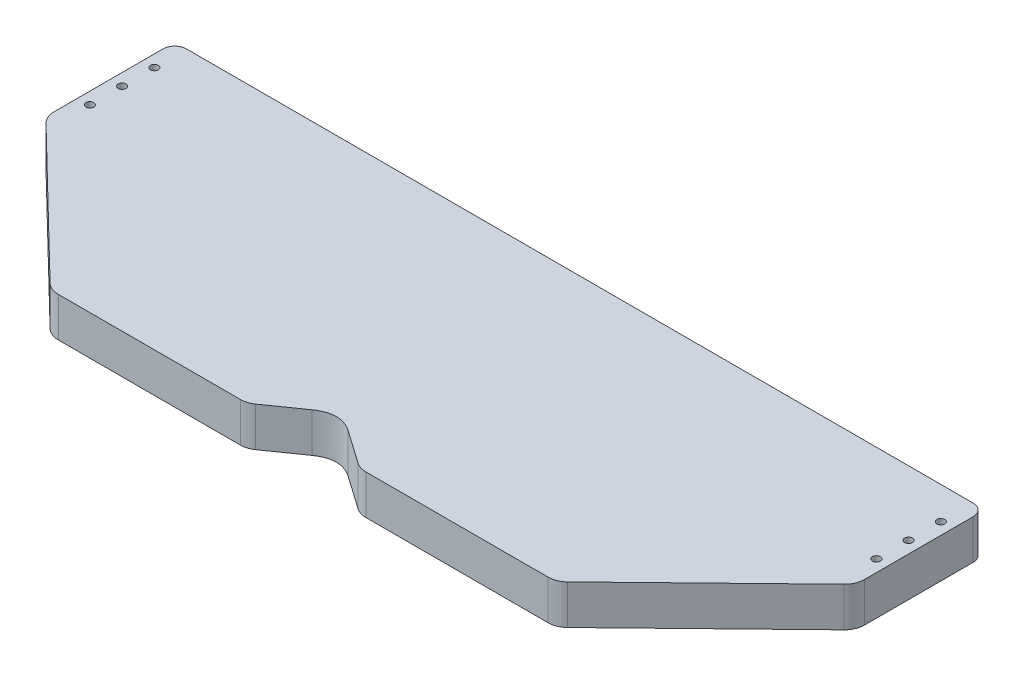
ISO-10303-21;
HEADER;
FILE_DESCRIPTION(('STEP AP214'),'2;1');
FILE_NAME('part.step','',(''),(''),'','','');
FILE_SCHEMA(('AUTOMOTIVE_DESIGN { 1 0 10303 214 1 1 1 1 }'));
ENDSEC;
DATA;
#1=APPLICATION_CONTEXT('core data for automotive mechanical design processes');
#2=APPLICATION_PROTOCOL_DEFINITION('international standard','automotive_design',2000,#1);
#3=PRODUCT_CONTEXT('',#1,'mechanical');
#4=PRODUCT('Part','Part','',(#3));
#5=PRODUCT_RELATED_PRODUCT_CATEGORY('part','',(#4));
#6=PRODUCT_DEFINITION_FORMATION('','',#4);
#7=PRODUCT_DEFINITION_CONTEXT('part definition',#1,'design');
#8=PRODUCT_DEFINITION('design','',#6,#7);
#9=PRODUCT_DEFINITION_SHAPE('','',#8);
#10=(LENGTH_UNIT() NAMED_UNIT(*) SI_UNIT(.MILLI.,.METRE.));
#11=(NAMED_UNIT(*) PLANE_ANGLE_UNIT() SI_UNIT($,.RADIAN.));
#12=(NAMED_UNIT(*) SI_UNIT($,.STERADIAN.) SOLID_ANGLE_UNIT());
#13=UNCERTAINTY_MEASURE_WITH_UNIT(LENGTH_MEASURE(1.E-05),#10,'distance_accuracy_value','');
#14=(GEOMETRIC_REPRESENTATION_CONTEXT(3) GLOBAL_UNCERTAINTY_ASSIGNED_CONTEXT((#13)) GLOBAL_UNIT_ASSIGNED_CONTEXT((#10,
#11,#12)) REPRESENTATION_CONTEXT('',''));
#15=CARTESIAN_POINT('',(0.,0.,0.));
#16=DIRECTION('',(0.,0.,1.));
#17=DIRECTION('',(1.,0.,0.));
#18=AXIS2_PLACEMENT_3D('',#15,#16,#17);
#19=CARTESIAN_POINT('',(0.,5.,0.));
#20=DIRECTION('',(0.,1.,0.));
#21=DIRECTION('',(0.,0.,1.));
#22=AXIS2_PLACEMENT_3D('',#19,#20,#21);
#23=PLANE('',#22);
#24=CARTESIAN_POINT('',(-99.5000000000001,5.,16.32));
#25=DIRECTION('',(0.,1.,0.));
#26=DIRECTION('',(0.,0.,-1.));
#27=AXIS2_PLACEMENT_3D('',#24,#25,#26);
#28=CIRCLE('',#27,0.999999999999998);
#29=CARTESIAN_POINT('',(-99.5000000000001,5.,15.32));
#30=VERTEX_POINT('',#29);
#31=EDGE_CURVE('E430',#30,#30,#28,.T.);
#32=ORIENTED_EDGE('',*,*,#31,.F.);
#33=EDGE_LOOP('',(#32));
#34=FACE_BOUND('',#33,.T.);
#35=CARTESIAN_POINT('',(99.5000000000002,5.,24.48));
#36=DIRECTION('',(0.,1.,0.));
#37=DIRECTION('',(0.,0.,1.));
#38=AXIS2_PLACEMENT_3D('',#35,#36,#37);
#39=CIRCLE('',#38,0.999999999999998);
#40=CARTESIAN_POINT('',(99.5000000000002,5.,25.48));
#41=VERTEX_POINT('',#40);
#42=EDGE_CURVE('E446',#41,#41,#39,.T.);
#43=ORIENTED_EDGE('',*,*,#42,.F.);
#44=EDGE_LOOP('',(#43));
#45=FACE_BOUND('',#44,.T.);
#46=CARTESIAN_POINT('',(99.5,5.,8.16));
#47=DIRECTION('',(0.,1.,0.));
#48=DIRECTION('',(0.,0.,1.));
#49=AXIS2_PLACEMENT_3D('',#46,#47,#48);
#50=CIRCLE('',#49,0.999999999999998);
#51=CARTESIAN_POINT('',(99.5,5.,9.16));
#52=VERTEX_POINT('',#51);
#53=EDGE_CURVE('E215',#52,#52,#50,.T.);
#54=ORIENTED_EDGE('',*,*,#53,.F.);
#55=EDGE_LOOP('',(#54));
#56=FACE_BOUND('',#55,.T.);
#57=DIRECTION('',(0.,0.,-1.));
#58=VECTOR('',#57,1.);
#59=CARTESIAN_POINT('',(102.5,5.,0.));
#60=LINE('',#59,#58);
#61=CARTESIAN_POINT('',(102.5,5.,30.5055705248841));
#62=VERTEX_POINT('',#61);
#63=CARTESIAN_POINT('',(102.5,5.,3.));
#64=VERTEX_POINT('',#63);
#65=EDGE_CURVE('E322',#62,#64,#60,.T.);
#66=ORIENTED_EDGE('',*,*,#65,.T.);
#67=CARTESIAN_POINT('',(99.5,5.,3.));
#68=DIRECTION('',(0.,1.,0.));
#69=DIRECTION('',(0.,0.,1.));
#70=AXIS2_PLACEMENT_3D('',#67,#68,#69);
#71=CIRCLE('',#70,3.);
#72=CARTESIAN_POINT('',(99.4999999999999,5.,0.));
#73=VERTEX_POINT('',#72);
#74=EDGE_CURVE('E669',#64,#73,#71,.T.);
#75=ORIENTED_EDGE('',*,*,#74,.T.);
#76=DIRECTION('',(-1.,0.,0.));
#77=VECTOR('',#76,1.);
#78=CARTESIAN_POINT('',(-102.5,5.,0.));
#79=LINE('',#78,#77);
#80=CARTESIAN_POINT('',(-99.5,5.,0.));
#81=VERTEX_POINT('',#80);
#82=EDGE_CURVE('E326',#73,#81,#79,.T.);
#83=ORIENTED_EDGE('',*,*,#82,.T.);
#84=CARTESIAN_POINT('',(-99.5,5.,3.00000000000004));
#85=DIRECTION('',(0.,1.,0.));
#86=DIRECTION('',(0.,0.,1.));
#87=AXIS2_PLACEMENT_3D('',#84,#85,#86);
#88=CIRCLE('',#87,3.);
#89=CARTESIAN_POINT('',(-102.5,5.,3.00000000000004));
#90=VERTEX_POINT('',#89);
#91=EDGE_CURVE('E663',#81,#90,#88,.T.);
#92=ORIENTED_EDGE('',*,*,#91,.T.);
#93=DIRECTION('',(0.,0.,1.));
#94=VECTOR('',#93,1.);
#95=CARTESIAN_POINT('',(-102.5,5.,32.6200000000001));
#96=LINE('',#95,#94);
#97=CARTESIAN_POINT('',(-102.5,5.,30.5055705248842));
#98=VERTEX_POINT('',#97);
#99=EDGE_CURVE('E330',#90,#98,#96,.T.);
#100=ORIENTED_EDGE('',*,*,#99,.T.);
#101=CARTESIAN_POINT('',(-97.5,5.,30.5055705248842));
#102=DIRECTION('',(0.,1.,0.));
#103=DIRECTION('',(0.,0.,1.));
#104=AXIS2_PLACEMENT_3D('',#101,#102,#103);
#105=CIRCLE('',#104,5.);
#106=CARTESIAN_POINT('',(-100.982969521015,5.,34.0928986832329));
#107=VERTEX_POINT('',#106);
#108=EDGE_CURVE('E697',#98,#107,#105,.T.);
#109=ORIENTED_EDGE('',*,*,#108,.T.);
#110=DIRECTION('',(0.717465631669735,0.,0.696593904202978));
#111=VECTOR('',#110,1.);
#112=CARTESIAN_POINT('',(-64.,5.,70.));
#113=LINE('',#112,#111);
#114=CARTESIAN_POINT('',(-65.4549990878431,5.,68.5873281583487));
#115=VERTEX_POINT('',#114);
#116=EDGE_CURVE('E333',#107,#115,#113,.T.);
#117=ORIENTED_EDGE('',*,*,#116,.T.);
#118=CARTESIAN_POINT('',(-61.9720295668282,5.,65.));
#119=DIRECTION('',(0.,1.,0.));
#120=DIRECTION('',(0.,0.,1.));
#121=AXIS2_PLACEMENT_3D('',#118,#119,#120);
#122=CIRCLE('',#121,5.);
#123=CARTESIAN_POINT('',(-61.9720295668282,5.,70.));
#124=VERTEX_POINT('',#123);
#125=EDGE_CURVE('E743',#115,#124,#122,.T.);
#126=ORIENTED_EDGE('',*,*,#125,.T.);
#127=DIRECTION('',(1.,0.,0.));
#128=VECTOR('',#127,1.);
#129=CARTESIAN_POINT('',(-14.2814800674211,5.,70.));
#130=LINE('',#129,#128);
#131=CARTESIAN_POINT('',(-15.857974011816,5.,70.));
#132=VERTEX_POINT('',#131);
#133=EDGE_CURVE('E336',#124,#132,#130,.T.);
#134=ORIENTED_EDGE('',*,*,#133,.T.);
#135=CARTESIAN_POINT('',(-15.857974011816,5.,65.));
#136=DIRECTION('',(0.,1.,0.));
#137=DIRECTION('',(0.,0.,1.));
#138=AXIS2_PLACEMENT_3D('',#135,#136,#137);
#139=CIRCLE('',#138,5.);
#140=CARTESIAN_POINT('',(-12.9900918300608,5.,69.0957602214449));
#141=VERTEX_POINT('',#140);
#142=EDGE_CURVE('E347',#132,#141,#139,.T.);
#143=ORIENTED_EDGE('',*,*,#142,.T.);
#144=DIRECTION('',(0.819152044288991,0.,-0.573576436351047));
#145=VECTOR('',#144,1.);
#146=CARTESIAN_POINT('',(0.,5.,60.));
#147=LINE('',#146,#145);
#148=CARTESIAN_POINT('',(-4.58861149080837,5.,63.2129803557797));
#149=VERTEX_POINT('',#148);
#150=EDGE_CURVE('E199',#141,#149,#147,.T.);
#151=ORIENTED_EDGE('',*,*,#150,.T.);
#152=CARTESIAN_POINT('',(4.58861149080838,5.,63.2129803557797));
#153=CARTESIAN_POINT('',(0.,5.,60.));
#154=CARTESIAN_POINT('',(-4.58861149080837,5.,63.2129803557797));
#155=(BOUNDED_CURVE() B_SPLINE_CURVE(2,(#152,#153,#154),.UNSPECIFIED.,.F.,
.F.) B_SPLINE_CURVE_WITH_KNOTS((3,3),(0.,1.),
.UNSPECIFIED.) CURVE() GEOMETRIC_REPRESENTATION_ITEM() RATIONAL_B_SPLINE_CURVE((1.,1.,1.)) REPRESENTATION_ITEM(''));
#156=CARTESIAN_POINT('',(4.58861149080838,5.,63.2129803557797));
#157=VERTEX_POINT('',#156);
#158=EDGE_CURVE('E12',#149,#157,#155,.F.);
#159=ORIENTED_EDGE('',*,*,#158,.T.);
#160=DIRECTION('',(0.819152044288991,0.,0.573576436351047));
#161=VECTOR('',#160,1.);
#162=CARTESIAN_POINT('',(14.2814800674211,5.,70.));
#163=LINE('',#162,#161);
#164=CARTESIAN_POINT('',(12.9900918300608,5.,69.0957602214449));
#165=VERTEX_POINT('',#164);
#166=EDGE_CURVE('E243',#157,#165,#163,.T.);
#167=ORIENTED_EDGE('',*,*,#166,.T.);
#168=CARTESIAN_POINT('',(15.857974011816,5.,65.));
#169=DIRECTION('',(0.,1.,0.));
#170=DIRECTION('',(0.,0.,1.));
#171=AXIS2_PLACEMENT_3D('',#168,#169,#170);
#172=CIRCLE('',#171,5.);
#173=CARTESIAN_POINT('',(15.857974011816,5.,70.));
#174=VERTEX_POINT('',#173);
#175=EDGE_CURVE('E768',#165,#174,#172,.T.);
#176=ORIENTED_EDGE('',*,*,#175,.T.);
#177=DIRECTION('',(1.,0.,0.));
#178=VECTOR('',#177,1.);
#179=CARTESIAN_POINT('',(64.,5.,70.));
#180=LINE('',#179,#178);
#181=CARTESIAN_POINT('',(61.9720295668282,5.,70.));
#182=VERTEX_POINT('',#181);
#183=EDGE_CURVE('E197',#174,#182,#180,.T.);
#184=ORIENTED_EDGE('',*,*,#183,.T.);
#185=CARTESIAN_POINT('',(61.9720295668282,5.,65.));
#186=DIRECTION('',(0.,1.,0.));
#187=DIRECTION('',(0.,0.,1.));
#188=AXIS2_PLACEMENT_3D('',#185,#186,#187);
#189=CIRCLE('',#188,5.);
#190=CARTESIAN_POINT('',(65.4549990878432,5.,68.5873281583487));
#191=VERTEX_POINT('',#190);
#192=EDGE_CURVE('E746',#182,#191,#189,.T.);
#193=ORIENTED_EDGE('',*,*,#192,.T.);
#194=DIRECTION('',(0.717465631669734,0.,-0.696593904202979));
#195=VECTOR('',#194,1.);
#196=CARTESIAN_POINT('',(102.5,5.,32.62));
#197=LINE('',#196,#195);
#198=CARTESIAN_POINT('',(100.982969521015,5.,34.0928986832328));
#199=VERTEX_POINT('',#198);
#200=EDGE_CURVE('E318',#191,#199,#197,.T.);
#201=ORIENTED_EDGE('',*,*,#200,.T.);
#202=CARTESIAN_POINT('',(97.5,5.,30.5055705248841));
#203=DIRECTION('',(0.,1.,0.));
#204=DIRECTION('',(0.,0.,1.));
#205=AXIS2_PLACEMENT_3D('',#202,#203,#204);
#206=CIRCLE('',#205,5.);
#207=EDGE_CURVE('E699',#199,#62,#206,.T.);
#208=ORIENTED_EDGE('',*,*,#207,.T.);
#209=EDGE_LOOP('',(#66,#75,#83,#92,#100,#109,#117,#126,#134,#143,#151,#159,#167,#176,#184,#193,
#201,#208));
#210=FACE_BOUND('',#209,.T.);
#211=CARTESIAN_POINT('',(99.5000000000001,5.,16.32));
#212=DIRECTION('',(0.,1.,0.));
#213=DIRECTION('',(0.,0.,1.));
#214=AXIS2_PLACEMENT_3D('',#211,#212,#213);
#215=CIRCLE('',#214,0.999999999999998);
#216=CARTESIAN_POINT('',(99.5000000000001,5.,17.32));
#217=VERTEX_POINT('',#216);
#218=EDGE_CURVE('E454',#217,#217,#215,.T.);
#219=ORIENTED_EDGE('',*,*,#218,.F.);
#220=EDGE_LOOP('',(#219));
#221=FACE_BOUND('',#220,.T.);
#222=CARTESIAN_POINT('',(-99.5000000000002,5.,24.48));
#223=DIRECTION('',(0.,1.,0.));
#224=DIRECTION('',(0.,0.,-1.));
#225=AXIS2_PLACEMENT_3D('',#222,#223,#224);
#226=CIRCLE('',#225,0.999999999999998);
#227=CARTESIAN_POINT('',(-99.5000000000002,5.,23.48));
#228=VERTEX_POINT('',#227);
#229=EDGE_CURVE('E438',#228,#228,#226,.T.);
#230=ORIENTED_EDGE('',*,*,#229,.F.);
#231=EDGE_LOOP('',(#230));
#232=FACE_BOUND('',#231,.T.);
#233=CARTESIAN_POINT('',(-99.5,5.,8.16));
#234=DIRECTION('',(0.,1.,0.));
#235=DIRECTION('',(0.,0.,-1.));
#236=AXIS2_PLACEMENT_3D('',#233,#234,#235);
#237=CIRCLE('',#236,0.999999999999998);
#238=CARTESIAN_POINT('',(-99.5,5.,7.16));
#239=VERTEX_POINT('',#238);
#240=EDGE_CURVE('E419',#239,#239,#237,.T.);
#241=ORIENTED_EDGE('',*,*,#240,.F.);
#242=EDGE_LOOP('',(#241));
#243=FACE_BOUND('',#242,.T.);
#244=ADVANCED_FACE('F44',(#34,#45,#56,#210,#221,#232,#243),#23,.T.);
#245=CARTESIAN_POINT('',(0.,-5.,0.));
#246=DIRECTION('',(0.,1.,0.));
#247=DIRECTION('',(0.,0.,1.));
#248=AXIS2_PLACEMENT_3D('',#245,#246,#247);
#249=PLANE('',#248);
#250=DIRECTION('',(-1.,0.,0.));
#251=VECTOR('',#250,1.);
#252=CARTESIAN_POINT('',(-102.5,-5.,0.));
#253=LINE('',#252,#251);
#254=CARTESIAN_POINT('',(99.4999999999999,-5.,0.));
#255=VERTEX_POINT('',#254);
#256=CARTESIAN_POINT('',(-99.5,-5.,0.));
#257=VERTEX_POINT('',#256);
#258=EDGE_CURVE('E224',#255,#257,#253,.T.);
#259=ORIENTED_EDGE('',*,*,#258,.F.);
#260=CARTESIAN_POINT('',(99.5,-5.,3.));
#261=DIRECTION('',(0.,1.,0.));
#262=DIRECTION('',(0.,0.,1.));
#263=AXIS2_PLACEMENT_3D('',#260,#261,#262);
#264=CIRCLE('',#263,3.);
#265=CARTESIAN_POINT('',(102.5,-5.,3.));
#266=VERTEX_POINT('',#265);
#267=EDGE_CURVE('E675',#255,#266,#264,.F.);
#268=ORIENTED_EDGE('',*,*,#267,.T.);
#269=DIRECTION('',(0.,0.,-1.));
#270=VECTOR('',#269,1.);
#271=CARTESIAN_POINT('',(102.5,-5.,0.));
#272=LINE('',#271,#270);
#273=CARTESIAN_POINT('',(102.5,-5.,30.5055705248841));
#274=VERTEX_POINT('',#273);
#275=EDGE_CURVE('E213',#274,#266,#272,.T.);
#276=ORIENTED_EDGE('',*,*,#275,.F.);
#277=CARTESIAN_POINT('',(97.5,-5.,30.5055705248841));
#278=DIRECTION('',(0.,1.,0.));
#279=DIRECTION('',(0.,0.,1.));
#280=AXIS2_PLACEMENT_3D('',#277,#278,#279);
#281=CIRCLE('',#280,5.);
#282=CARTESIAN_POINT('',(100.982969521015,-5.,34.0928986832328));
#283=VERTEX_POINT('',#282);
#284=EDGE_CURVE('E694',#274,#283,#281,.F.);
#285=ORIENTED_EDGE('',*,*,#284,.T.);
#286=DIRECTION('',(0.717465631669734,0.,-0.696593904202979));
#287=VECTOR('',#286,1.);
#288=CARTESIAN_POINT('',(102.5,-5.,32.62));
#289=LINE('',#288,#287);
#290=CARTESIAN_POINT('',(65.4549990878432,-5.,68.5873281583487));
#291=VERTEX_POINT('',#290);
#292=EDGE_CURVE('E207',#291,#283,#289,.T.);
#293=ORIENTED_EDGE('',*,*,#292,.F.);
#294=CARTESIAN_POINT('',(61.9720295668282,-5.,65.));
#295=DIRECTION('',(0.,1.,0.));
#296=DIRECTION('',(0.,0.,1.));
#297=AXIS2_PLACEMENT_3D('',#294,#295,#296);
#298=CIRCLE('',#297,5.);
#299=CARTESIAN_POINT('',(61.9720295668282,-5.,70.));
#300=VERTEX_POINT('',#299);
#301=EDGE_CURVE('E205',#291,#300,#298,.F.);
#302=ORIENTED_EDGE('',*,*,#301,.T.);
#303=DIRECTION('',(1.,0.,0.));
#304=VECTOR('',#303,1.);
#305=CARTESIAN_POINT('',(64.,-5.,70.));
#306=LINE('',#305,#304);
#307=CARTESIAN_POINT('',(15.857974011816,-5.,70.));
#308=VERTEX_POINT('',#307);
#309=EDGE_CURVE('E194',#308,#300,#306,.T.);
#310=ORIENTED_EDGE('',*,*,#309,.F.);
#311=CARTESIAN_POINT('',(15.857974011816,-5.,65.));
#312=DIRECTION('',(0.,1.,0.));
#313=DIRECTION('',(0.,0.,1.));
#314=AXIS2_PLACEMENT_3D('',#311,#312,#313);
#315=CIRCLE('',#314,5.);
#316=CARTESIAN_POINT('',(12.9900918300608,-5.,69.0957602214449));
#317=VERTEX_POINT('',#316);
#318=EDGE_CURVE('E179',#308,#317,#315,.F.);
#319=ORIENTED_EDGE('',*,*,#318,.T.);
#320=DIRECTION('',(0.819152044288991,0.,0.573576436351047));
#321=VECTOR('',#320,1.);
#322=CARTESIAN_POINT('',(14.2814800674211,-5.,70.));
#323=LINE('',#322,#321);
#324=CARTESIAN_POINT('',(4.58861149080838,-5.,63.2129803557797));
#325=VERTEX_POINT('',#324);
#326=EDGE_CURVE('E208',#325,#317,#323,.T.);
#327=ORIENTED_EDGE('',*,*,#326,.F.);
#328=CARTESIAN_POINT('',(-4.58861149080837,-5.,63.2129803557797));
#329=CARTESIAN_POINT('',(0.,-5.,60.));
#330=CARTESIAN_POINT('',(4.58861149080838,-5.,63.2129803557797));
#331=(BOUNDED_CURVE() B_SPLINE_CURVE(2,(#328,#329,#330),.UNSPECIFIED.,.F.,
.F.) B_SPLINE_CURVE_WITH_KNOTS((3,3),(0.,1.),
.UNSPECIFIED.) CURVE() GEOMETRIC_REPRESENTATION_ITEM() RATIONAL_B_SPLINE_CURVE((1.,1.,1.)) REPRESENTATION_ITEM(''));
#332=CARTESIAN_POINT('',(-4.58861149080837,-5.,63.2129803557797));
#333=VERTEX_POINT('',#332);
#334=EDGE_CURVE('E59',#325,#333,#331,.F.);
#335=ORIENTED_EDGE('',*,*,#334,.T.);
#336=DIRECTION('',(0.819152044288991,0.,-0.573576436351047));
#337=VECTOR('',#336,1.);
#338=CARTESIAN_POINT('',(0.,-5.,60.));
#339=LINE('',#338,#337);
#340=CARTESIAN_POINT('',(-12.9900918300608,-5.,69.0957602214449));
#341=VERTEX_POINT('',#340);
#342=EDGE_CURVE('E237',#341,#333,#339,.T.);
#343=ORIENTED_EDGE('',*,*,#342,.F.);
#344=CARTESIAN_POINT('',(-15.857974011816,-5.,65.));
#345=DIRECTION('',(0.,1.,0.));
#346=DIRECTION('',(0.,0.,1.));
#347=AXIS2_PLACEMENT_3D('',#344,#345,#346);
#348=CIRCLE('',#347,5.);
#349=CARTESIAN_POINT('',(-15.857974011816,-5.,70.));
#350=VERTEX_POINT('',#349);
#351=EDGE_CURVE('E188',#341,#350,#348,.F.);
#352=ORIENTED_EDGE('',*,*,#351,.T.);
#353=DIRECTION('',(1.,0.,0.));
#354=VECTOR('',#353,1.);
#355=CARTESIAN_POINT('',(-14.2814800674211,-5.,70.));
#356=LINE('',#355,#354);
#357=CARTESIAN_POINT('',(-61.9720295668282,-5.,70.));
#358=VERTEX_POINT('',#357);
#359=EDGE_CURVE('E234',#358,#350,#356,.T.);
#360=ORIENTED_EDGE('',*,*,#359,.F.);
#361=CARTESIAN_POINT('',(-61.9720295668282,-5.,65.));
#362=DIRECTION('',(0.,1.,0.));
#363=DIRECTION('',(0.,0.,1.));
#364=AXIS2_PLACEMENT_3D('',#361,#362,#363);
#365=CIRCLE('',#364,5.);
#366=CARTESIAN_POINT('',(-65.4549990878431,-5.,68.5873281583487));
#367=VERTEX_POINT('',#366);
#368=EDGE_CURVE('E753',#358,#367,#365,.F.);
#369=ORIENTED_EDGE('',*,*,#368,.T.);
#370=DIRECTION('',(0.717465631669735,0.,0.696593904202978));
#371=VECTOR('',#370,1.);
#372=CARTESIAN_POINT('',(-64.,-5.,70.));
#373=LINE('',#372,#371);
#374=CARTESIAN_POINT('',(-100.982969521015,-5.,34.0928986832329));
#375=VERTEX_POINT('',#374);
#376=EDGE_CURVE('E231',#375,#367,#373,.T.);
#377=ORIENTED_EDGE('',*,*,#376,.F.);
#378=CARTESIAN_POINT('',(-97.5,-5.,30.5055705248842));
#379=DIRECTION('',(0.,1.,0.));
#380=DIRECTION('',(0.,0.,1.));
#381=AXIS2_PLACEMENT_3D('',#378,#379,#380);
#382=CIRCLE('',#381,5.);
#383=CARTESIAN_POINT('',(-102.5,-5.,30.5055705248842));
#384=VERTEX_POINT('',#383);
#385=EDGE_CURVE('E687',#375,#384,#382,.F.);
#386=ORIENTED_EDGE('',*,*,#385,.T.);
#387=DIRECTION('',(0.,0.,1.));
#388=VECTOR('',#387,1.);
#389=CARTESIAN_POINT('',(-102.5,-5.,32.6200000000001));
#390=LINE('',#389,#388);
#391=CARTESIAN_POINT('',(-102.5,-5.,3.00000000000004));
#392=VERTEX_POINT('',#391);
#393=EDGE_CURVE('E228',#392,#384,#390,.T.);
#394=ORIENTED_EDGE('',*,*,#393,.F.);
#395=CARTESIAN_POINT('',(-99.5,-5.,3.00000000000004));
#396=DIRECTION('',(0.,1.,0.));
#397=DIRECTION('',(0.,0.,1.));
#398=AXIS2_PLACEMENT_3D('',#395,#396,#397);
#399=CIRCLE('',#398,3.);
#400=EDGE_CURVE('E685',#392,#257,#399,.F.);
#401=ORIENTED_EDGE('',*,*,#400,.T.);
#402=EDGE_LOOP('',(#259,#268,#276,#285,#293,#302,#310,#319,#327,#335,#343,#352,#360,#369,#377,
#386,#394,#401));
#403=FACE_BOUND('',#402,.T.);
#404=CARTESIAN_POINT('',(99.5,-5.,8.16));
#405=DIRECTION('',(0.,1.,0.));
#406=DIRECTION('',(0.,0.,1.));
#407=AXIS2_PLACEMENT_3D('',#404,#405,#406);
#408=CIRCLE('',#407,0.999999999999998);
#409=CARTESIAN_POINT('',(99.5,-5.,9.16));
#410=VERTEX_POINT('',#409);
#411=EDGE_CURVE('E314',#410,#410,#408,.T.);
#412=ORIENTED_EDGE('',*,*,#411,.T.);
#413=EDGE_LOOP('',(#412));
#414=FACE_BOUND('',#413,.T.);
#415=CARTESIAN_POINT('',(99.5000000000001,-5.,16.32));
#416=DIRECTION('',(0.,1.,0.));
#417=DIRECTION('',(0.,0.,1.));
#418=AXIS2_PLACEMENT_3D('',#415,#416,#417);
#419=CIRCLE('',#418,0.999999999999998);
#420=CARTESIAN_POINT('',(99.5000000000001,-5.,17.32));
#421=VERTEX_POINT('',#420);
#422=EDGE_CURVE('E450',#421,#421,#419,.T.);
#423=ORIENTED_EDGE('',*,*,#422,.T.);
#424=EDGE_LOOP('',(#423));
#425=FACE_BOUND('',#424,.T.);
#426=CARTESIAN_POINT('',(99.5000000000002,-5.,24.48));
#427=DIRECTION('',(0.,1.,0.));
#428=DIRECTION('',(0.,0.,1.));
#429=AXIS2_PLACEMENT_3D('',#426,#427,#428);
#430=CIRCLE('',#429,0.999999999999998);
#431=CARTESIAN_POINT('',(99.5000000000002,-5.,25.48));
#432=VERTEX_POINT('',#431);
#433=EDGE_CURVE('E442',#432,#432,#430,.T.);
#434=ORIENTED_EDGE('',*,*,#433,.T.);
#435=EDGE_LOOP('',(#434));
#436=FACE_BOUND('',#435,.T.);
#437=CARTESIAN_POINT('',(-99.5000000000002,-5.,24.48));
#438=DIRECTION('',(0.,1.,0.));
#439=DIRECTION('',(0.,0.,-1.));
#440=AXIS2_PLACEMENT_3D('',#437,#438,#439);
#441=CIRCLE('',#440,0.999999999999998);
#442=CARTESIAN_POINT('',(-99.5000000000002,-5.,23.48));
#443=VERTEX_POINT('',#442);
#444=EDGE_CURVE('E434',#443,#443,#441,.T.);
#445=ORIENTED_EDGE('',*,*,#444,.T.);
#446=EDGE_LOOP('',(#445));
#447=FACE_BOUND('',#446,.T.);
#448=CARTESIAN_POINT('',(-99.5000000000001,-5.,16.32));
#449=DIRECTION('',(0.,1.,0.));
#450=DIRECTION('',(0.,0.,-1.));
#451=AXIS2_PLACEMENT_3D('',#448,#449,#450);
#452=CIRCLE('',#451,0.999999999999998);
#453=CARTESIAN_POINT('',(-99.5000000000001,-5.,15.32));
#454=VERTEX_POINT('',#453);
#455=EDGE_CURVE('E427',#454,#454,#452,.T.);
#456=ORIENTED_EDGE('',*,*,#455,.T.);
#457=EDGE_LOOP('',(#456));
#458=FACE_BOUND('',#457,.T.);
#459=CARTESIAN_POINT('',(-99.5,-5.,8.16));
#460=DIRECTION('',(0.,1.,0.));
#461=DIRECTION('',(0.,0.,-1.));
#462=AXIS2_PLACEMENT_3D('',#459,#460,#461);
#463=CIRCLE('',#462,0.999999999999998);
#464=CARTESIAN_POINT('',(-99.5,-5.,7.16));
#465=VERTEX_POINT('',#464);
#466=EDGE_CURVE('E422',#465,#465,#463,.T.);
#467=ORIENTED_EDGE('',*,*,#466,.T.);
#468=EDGE_LOOP('',(#467));
#469=FACE_BOUND('',#468,.T.);
#470=ADVANCED_FACE('F202',(#403,#414,#425,#436,#447,#458,#469),#249,.F.);
#471=CARTESIAN_POINT('',(14.2814800674211,5.,70.));
#472=DIRECTION('',(0.573576436351047,0.,-0.819152044288991));
#473=DIRECTION('',(-0.819152044288991,0.,-0.573576436351047));
#474=AXIS2_PLACEMENT_3D('',#471,#472,#473);
#475=PLANE('',#474);
#476=ORIENTED_EDGE('',*,*,#166,.F.);
#477=CARTESIAN_POINT('',(4.58861149080838,-5.5,63.2129803557797));
#478=CARTESIAN_POINT('',(4.58861149080838,-1.83333333333334,63.2129803557797));
#479=CARTESIAN_POINT('',(4.58861149080838,1.83333333333334,63.2129803557797));
#480=CARTESIAN_POINT('',(4.58861149080838,5.5,63.2129803557797));
#481=(BOUNDED_CURVE() B_SPLINE_CURVE(3,(#477,#478,#479,#480),.UNSPECIFIED.,.F.,
.F.) B_SPLINE_CURVE_WITH_KNOTS((4,4),(-0.0105,0.0005),
.UNSPECIFIED.) CURVE() GEOMETRIC_REPRESENTATION_ITEM() RATIONAL_B_SPLINE_CURVE((1.,1.,1.,1.)) REPRESENTATION_ITEM(''));
#482=EDGE_CURVE('E307',#157,#325,#481,.F.);
#483=ORIENTED_EDGE('',*,*,#482,.T.);
#484=ORIENTED_EDGE('',*,*,#326,.T.);
#485=DIRECTION('',(0.,-1.,0.));
#486=VECTOR('',#485,1.);
#487=CARTESIAN_POINT('',(12.9900918300608,5.,69.0957602214449));
#488=LINE('',#487,#486);
#489=EDGE_CURVE('E185',#317,#165,#488,.F.);
#490=ORIENTED_EDGE('',*,*,#489,.T.);
#491=EDGE_LOOP('',(#476,#483,#484,#490));
#492=FACE_BOUND('',#491,.T.);
#493=ADVANCED_FACE('F289',(#492),#475,.F.);
#494=CARTESIAN_POINT('',(64.,5.,70.));
#495=DIRECTION('',(0.,0.,-1.));
#496=DIRECTION('',(-1.,0.,0.));
#497=AXIS2_PLACEMENT_3D('',#494,#495,#496);
#498=PLANE('',#497);
#499=ORIENTED_EDGE('',*,*,#309,.T.);
#500=DIRECTION('',(0.,-1.,0.));
#501=VECTOR('',#500,1.);
#502=CARTESIAN_POINT('',(61.9720295668282,5.,70.));
#503=LINE('',#502,#501);
#504=EDGE_CURVE('E734',#300,#182,#503,.F.);
#505=ORIENTED_EDGE('',*,*,#504,.T.);
#506=ORIENTED_EDGE('',*,*,#183,.F.);
#507=DIRECTION('',(0.,-1.,0.));
#508=VECTOR('',#507,1.);
#509=CARTESIAN_POINT('',(15.857974011816,5.,70.));
#510=LINE('',#509,#508);
#511=EDGE_CURVE('E183',#174,#308,#510,.T.);
#512=ORIENTED_EDGE('',*,*,#511,.T.);
#513=EDGE_LOOP('',(#499,#505,#506,#512));
#514=FACE_BOUND('',#513,.T.);
#515=ADVANCED_FACE('F193',(#514),#498,.F.);
#516=CARTESIAN_POINT('',(102.5,5.,32.62));
#517=DIRECTION('',(-0.696593904202979,0.,-0.717465631669734));
#518=DIRECTION('',(-0.717465631669734,0.,0.696593904202979));
#519=AXIS2_PLACEMENT_3D('',#516,#517,#518);
#520=PLANE('',#519);
#521=ORIENTED_EDGE('',*,*,#292,.T.);
#522=DIRECTION('',(0.,-1.,0.));
#523=VECTOR('',#522,1.);
#524=CARTESIAN_POINT('',(100.982969521015,5.,34.0928986832328));
#525=LINE('',#524,#523);
#526=EDGE_CURVE('E711',#283,#199,#525,.F.);
#527=ORIENTED_EDGE('',*,*,#526,.T.);
#528=ORIENTED_EDGE('',*,*,#200,.F.);
#529=DIRECTION('',(0.,-1.,0.));
#530=VECTOR('',#529,1.);
#531=CARTESIAN_POINT('',(65.4549990878431,5.,68.5873281583487));
#532=LINE('',#531,#530);
#533=EDGE_CURVE('E739',#191,#291,#532,.T.);
#534=ORIENTED_EDGE('',*,*,#533,.T.);
#535=EDGE_LOOP('',(#521,#527,#528,#534));
#536=FACE_BOUND('',#535,.T.);
#537=ADVANCED_FACE('F282',(#536),#520,.F.);
#538=CARTESIAN_POINT('',(102.5,5.,0.));
#539=DIRECTION('',(-1.,0.,0.));
#540=DIRECTION('',(0.,0.,1.));
#541=AXIS2_PLACEMENT_3D('',#538,#539,#540);
#542=PLANE('',#541);
#543=ORIENTED_EDGE('',*,*,#275,.T.);
#544=DIRECTION('',(0.,-1.,0.));
#545=VECTOR('',#544,1.);
#546=CARTESIAN_POINT('',(102.5,5.,3.));
#547=LINE('',#546,#545);
#548=EDGE_CURVE('E670',#266,#64,#547,.F.);
#549=ORIENTED_EDGE('',*,*,#548,.T.);
#550=ORIENTED_EDGE('',*,*,#65,.F.);
#551=DIRECTION('',(0.,-1.,0.));
#552=VECTOR('',#551,1.);
#553=CARTESIAN_POINT('',(102.5,5.,30.5055705248841));
#554=LINE('',#553,#552);
#555=EDGE_CURVE('E707',#62,#274,#554,.T.);
#556=ORIENTED_EDGE('',*,*,#555,.T.);
#557=EDGE_LOOP('',(#543,#549,#550,#556));
#558=FACE_BOUND('',#557,.T.);
#559=ADVANCED_FACE('F278',(#558),#542,.F.);
#560=CARTESIAN_POINT('',(-102.5,5.,0.));
#561=DIRECTION('',(0.,0.,1.));
#562=DIRECTION('',(1.,0.,0.));
#563=AXIS2_PLACEMENT_3D('',#560,#561,#562);
#564=PLANE('',#563);
#565=ORIENTED_EDGE('',*,*,#82,.F.);
#566=DIRECTION('',(0.,-1.,0.));
#567=VECTOR('',#566,1.);
#568=CARTESIAN_POINT('',(99.5,5.,0.));
#569=LINE('',#568,#567);
#570=EDGE_CURVE('E716',#73,#255,#569,.T.);
#571=ORIENTED_EDGE('',*,*,#570,.T.);
#572=ORIENTED_EDGE('',*,*,#258,.T.);
#573=DIRECTION('',(0.,-1.,0.));
#574=VECTOR('',#573,1.);
#575=CARTESIAN_POINT('',(-99.5,5.,0.));
#576=LINE('',#575,#574);
#577=EDGE_CURVE('E664',#257,#81,#576,.F.);
#578=ORIENTED_EDGE('',*,*,#577,.T.);
#579=EDGE_LOOP('',(#565,#571,#572,#578));
#580=FACE_BOUND('',#579,.T.);
#581=ADVANCED_FACE('F274',(#580),#564,.F.);
#582=CARTESIAN_POINT('',(-102.5,5.,32.6200000000001));
#583=DIRECTION('',(1.,0.,0.));
#584=DIRECTION('',(0.,0.,-1.));
#585=AXIS2_PLACEMENT_3D('',#582,#583,#584);
#586=PLANE('',#585);
#587=ORIENTED_EDGE('',*,*,#99,.F.);
#588=DIRECTION('',(0.,-1.,0.));
#589=VECTOR('',#588,1.);
#590=CARTESIAN_POINT('',(-102.5,5.,3.00000000000004));
#591=LINE('',#590,#589);
#592=EDGE_CURVE('E666',#90,#392,#591,.T.);
#593=ORIENTED_EDGE('',*,*,#592,.T.);
#594=ORIENTED_EDGE('',*,*,#393,.T.);
#595=DIRECTION('',(0.,-1.,0.));
#596=VECTOR('',#595,1.);
#597=CARTESIAN_POINT('',(-102.5,5.,30.5055705248842));
#598=LINE('',#597,#596);
#599=EDGE_CURVE('E693',#384,#98,#598,.F.);
#600=ORIENTED_EDGE('',*,*,#599,.T.);
#601=EDGE_LOOP('',(#587,#593,#594,#600));
#602=FACE_BOUND('',#601,.T.);
#603=ADVANCED_FACE('F270',(#602),#586,.F.);
#604=CARTESIAN_POINT('',(-64.,5.,70.));
#605=DIRECTION('',(0.696593904202979,0.,-0.717465631669735));
#606=DIRECTION('',(-0.717465631669735,0.,-0.696593904202979));
#607=AXIS2_PLACEMENT_3D('',#604,#605,#606);
#608=PLANE('',#607);
#609=ORIENTED_EDGE('',*,*,#116,.F.);
#610=DIRECTION('',(0.,-1.,0.));
#611=VECTOR('',#610,1.);
#612=CARTESIAN_POINT('',(-100.982969521015,5.,34.0928986832329));
#613=LINE('',#612,#611);
#614=EDGE_CURVE('E732',#107,#375,#613,.T.);
#615=ORIENTED_EDGE('',*,*,#614,.T.);
#616=ORIENTED_EDGE('',*,*,#376,.T.);
#617=DIRECTION('',(0.,-1.,0.));
#618=VECTOR('',#617,1.);
#619=CARTESIAN_POINT('',(-65.4549990878431,5.,68.5873281583487));
#620=LINE('',#619,#618);
#621=EDGE_CURVE('E749',#367,#115,#620,.F.);
#622=ORIENTED_EDGE('',*,*,#621,.T.);
#623=EDGE_LOOP('',(#609,#615,#616,#622));
#624=FACE_BOUND('',#623,.T.);
#625=ADVANCED_FACE('F266',(#624),#608,.F.);
#626=CARTESIAN_POINT('',(-14.2814800674211,5.,70.));
#627=DIRECTION('',(0.,0.,-1.));
#628=DIRECTION('',(-1.,0.,0.));
#629=AXIS2_PLACEMENT_3D('',#626,#627,#628);
#630=PLANE('',#629);
#631=ORIENTED_EDGE('',*,*,#133,.F.);
#632=DIRECTION('',(0.,-1.,0.));
#633=VECTOR('',#632,1.);
#634=CARTESIAN_POINT('',(-61.9720295668282,5.,70.));
#635=LINE('',#634,#633);
#636=EDGE_CURVE('E758',#124,#358,#635,.T.);
#637=ORIENTED_EDGE('',*,*,#636,.T.);
#638=ORIENTED_EDGE('',*,*,#359,.T.);
#639=DIRECTION('',(0.,-1.,0.));
#640=VECTOR('',#639,1.);
#641=CARTESIAN_POINT('',(-15.857974011816,5.,70.));
#642=LINE('',#641,#640);
#643=EDGE_CURVE('E762',#350,#132,#642,.F.);
#644=ORIENTED_EDGE('',*,*,#643,.T.);
#645=EDGE_LOOP('',(#631,#637,#638,#644));
#646=FACE_BOUND('',#645,.T.);
#647=ADVANCED_FACE('F261',(#646),#630,.F.);
#648=CARTESIAN_POINT('',(0.,5.,60.));
#649=DIRECTION('',(-0.573576436351047,0.,-0.819152044288991));
#650=DIRECTION('',(-0.819152044288991,0.,0.573576436351047));
#651=AXIS2_PLACEMENT_3D('',#648,#649,#650);
#652=PLANE('',#651);
#653=ORIENTED_EDGE('',*,*,#342,.T.);
#654=CARTESIAN_POINT('',(-4.58861149080837,5.5,63.2129803557797));
#655=CARTESIAN_POINT('',(-4.58861149080837,1.83333333333334,63.2129803557797));
#656=CARTESIAN_POINT('',(-4.58861149080837,-1.83333333333334,63.2129803557797));
#657=CARTESIAN_POINT('',(-4.58861149080837,-5.5,63.2129803557797));
#658=(BOUNDED_CURVE() B_SPLINE_CURVE(3,(#654,#655,#656,#657),.UNSPECIFIED.,.F.,
.F.) B_SPLINE_CURVE_WITH_KNOTS((4,4),(-0.0105,0.0005),
.UNSPECIFIED.) CURVE() GEOMETRIC_REPRESENTATION_ITEM() RATIONAL_B_SPLINE_CURVE((1.,1.,1.,1.)) REPRESENTATION_ITEM(''));
#659=EDGE_CURVE('E73',#333,#149,#658,.F.);
#660=ORIENTED_EDGE('',*,*,#659,.T.);
#661=ORIENTED_EDGE('',*,*,#150,.F.);
#662=DIRECTION('',(0.,-1.,0.));
#663=VECTOR('',#662,1.);
#664=CARTESIAN_POINT('',(-12.9900918300608,5.,69.0957602214449));
#665=LINE('',#664,#663);
#666=EDGE_CURVE('E765',#141,#341,#665,.T.);
#667=ORIENTED_EDGE('',*,*,#666,.T.);
#668=EDGE_LOOP('',(#653,#660,#661,#667));
#669=FACE_BOUND('',#668,.T.);
#670=ADVANCED_FACE('F250',(#669),#652,.F.);
#671=CARTESIAN_POINT('',(99.5,5.,8.16));
#672=DIRECTION('',(0.,-1.,0.));
#673=DIRECTION('',(0.,0.,-1.));
#674=AXIS2_PLACEMENT_3D('',#671,#672,#673);
#675=CYLINDRICAL_SURFACE('',#674,0.999999999999998);
#676=ORIENTED_EDGE('',*,*,#53,.T.);
#677=EDGE_LOOP('',(#676));
#678=FACE_BOUND('',#677,.T.);
#679=ORIENTED_EDGE('',*,*,#411,.F.);
#680=EDGE_LOOP('',(#679));
#681=FACE_BOUND('',#680,.T.);
#682=ADVANCED_FACE('F260',(#678,#681),#675,.F.);
#683=CARTESIAN_POINT('',(99.5000000000001,5.,16.32));
#684=DIRECTION('',(0.,-1.,0.));
#685=DIRECTION('',(0.,0.,-1.));
#686=AXIS2_PLACEMENT_3D('',#683,#684,#685);
#687=CYLINDRICAL_SURFACE('',#686,0.999999999999998);
#688=ORIENTED_EDGE('',*,*,#218,.T.);
#689=EDGE_LOOP('',(#688));
#690=FACE_BOUND('',#689,.T.);
#691=ORIENTED_EDGE('',*,*,#422,.F.);
#692=EDGE_LOOP('',(#691));
#693=FACE_BOUND('',#692,.T.);
#694=ADVANCED_FACE('F392',(#690,#693),#687,.F.);
#695=CARTESIAN_POINT('',(99.5000000000002,5.,24.48));
#696=DIRECTION('',(0.,-1.,0.));
#697=DIRECTION('',(0.,0.,-1.));
#698=AXIS2_PLACEMENT_3D('',#695,#696,#697);
#699=CYLINDRICAL_SURFACE('',#698,0.999999999999998);
#700=ORIENTED_EDGE('',*,*,#42,.T.);
#701=EDGE_LOOP('',(#700));
#702=FACE_BOUND('',#701,.T.);
#703=ORIENTED_EDGE('',*,*,#433,.F.);
#704=EDGE_LOOP('',(#703));
#705=FACE_BOUND('',#704,.T.);
#706=ADVANCED_FACE('F396',(#702,#705),#699,.F.);
#707=CARTESIAN_POINT('',(-99.5000000000002,5.,24.48));
#708=DIRECTION('',(0.,-1.,0.));
#709=DIRECTION('',(0.,0.,-1.));
#710=AXIS2_PLACEMENT_3D('',#707,#708,#709);
#711=CYLINDRICAL_SURFACE('',#710,0.999999999999998);
#712=ORIENTED_EDGE('',*,*,#229,.T.);
#713=EDGE_LOOP('',(#712));
#714=FACE_BOUND('',#713,.T.);
#715=ORIENTED_EDGE('',*,*,#444,.F.);
#716=EDGE_LOOP('',(#715));
#717=FACE_BOUND('',#716,.T.);
#718=ADVANCED_FACE('F400',(#714,#717),#711,.F.);
#719=CARTESIAN_POINT('',(-99.5000000000001,5.,16.32));
#720=DIRECTION('',(0.,-1.,0.));
#721=DIRECTION('',(0.,0.,-1.));
#722=AXIS2_PLACEMENT_3D('',#719,#720,#721);
#723=CYLINDRICAL_SURFACE('',#722,0.999999999999998);
#724=ORIENTED_EDGE('',*,*,#31,.T.);
#725=EDGE_LOOP('',(#724));
#726=FACE_BOUND('',#725,.T.);
#727=ORIENTED_EDGE('',*,*,#455,.F.);
#728=EDGE_LOOP('',(#727));
#729=FACE_BOUND('',#728,.T.);
#730=ADVANCED_FACE('F404',(#726,#729),#723,.F.);
#731=CARTESIAN_POINT('',(-99.5,5.,8.16));
#732=DIRECTION('',(0.,-1.,0.));
#733=DIRECTION('',(0.,0.,-1.));
#734=AXIS2_PLACEMENT_3D('',#731,#732,#733);
#735=CYLINDRICAL_SURFACE('',#734,0.999999999999998);
#736=ORIENTED_EDGE('',*,*,#240,.T.);
#737=EDGE_LOOP('',(#736));
#738=FACE_BOUND('',#737,.T.);
#739=ORIENTED_EDGE('',*,*,#466,.F.);
#740=EDGE_LOOP('',(#739));
#741=FACE_BOUND('',#740,.T.);
#742=ADVANCED_FACE('F408',(#738,#741),#735,.F.);
#743=CARTESIAN_POINT('',(15.857974011816,5.,65.));
#744=DIRECTION('',(0.,-1.,0.));
#745=DIRECTION('',(0.,0.,-1.));
#746=AXIS2_PLACEMENT_3D('',#743,#744,#745);
#747=CYLINDRICAL_SURFACE('',#746,5.);
#748=ORIENTED_EDGE('',*,*,#175,.F.);
#749=ORIENTED_EDGE('',*,*,#489,.F.);
#750=ORIENTED_EDGE('',*,*,#318,.F.);
#751=ORIENTED_EDGE('',*,*,#511,.F.);
#752=EDGE_LOOP('',(#748,#749,#750,#751));
#753=FACE_BOUND('',#752,.T.);
#754=ADVANCED_FACE('F182',(#753),#747,.T.);
#755=CARTESIAN_POINT('',(-15.857974011816,5.,65.));
#756=DIRECTION('',(0.,-1.,0.));
#757=DIRECTION('',(0.,0.,-1.));
#758=AXIS2_PLACEMENT_3D('',#755,#756,#757);
#759=CYLINDRICAL_SURFACE('',#758,5.);
#760=ORIENTED_EDGE('',*,*,#142,.F.);
#761=ORIENTED_EDGE('',*,*,#643,.F.);
#762=ORIENTED_EDGE('',*,*,#351,.F.);
#763=ORIENTED_EDGE('',*,*,#666,.F.);
#764=EDGE_LOOP('',(#760,#761,#762,#763));
#765=FACE_BOUND('',#764,.T.);
#766=ADVANCED_FACE('F415',(#765),#759,.T.);
#767=CARTESIAN_POINT('',(-61.9720295668282,5.,65.));
#768=DIRECTION('',(0.,-1.,0.));
#769=DIRECTION('',(0.,0.,-1.));
#770=AXIS2_PLACEMENT_3D('',#767,#768,#769);
#771=CYLINDRICAL_SURFACE('',#770,5.);
#772=ORIENTED_EDGE('',*,*,#125,.F.);
#773=ORIENTED_EDGE('',*,*,#621,.F.);
#774=ORIENTED_EDGE('',*,*,#368,.F.);
#775=ORIENTED_EDGE('',*,*,#636,.F.);
#776=EDGE_LOOP('',(#772,#773,#774,#775));
#777=FACE_BOUND('',#776,.T.);
#778=ADVANCED_FACE('F564',(#777),#771,.T.);
#779=CARTESIAN_POINT('',(61.9720295668282,5.,65.));
#780=DIRECTION('',(0.,-1.,0.));
#781=DIRECTION('',(0.,0.,-1.));
#782=AXIS2_PLACEMENT_3D('',#779,#780,#781);
#783=CYLINDRICAL_SURFACE('',#782,5.);
#784=ORIENTED_EDGE('',*,*,#192,.F.);
#785=ORIENTED_EDGE('',*,*,#504,.F.);
#786=ORIENTED_EDGE('',*,*,#301,.F.);
#787=ORIENTED_EDGE('',*,*,#533,.F.);
#788=EDGE_LOOP('',(#784,#785,#786,#787));
#789=FACE_BOUND('',#788,.T.);
#790=ADVANCED_FACE('F573',(#789),#783,.T.);
#791=CARTESIAN_POINT('',(-97.5,5.,30.5055705248842));
#792=DIRECTION('',(0.,-1.,0.));
#793=DIRECTION('',(0.,0.,-1.));
#794=AXIS2_PLACEMENT_3D('',#791,#792,#793);
#795=CYLINDRICAL_SURFACE('',#794,5.);
#796=ORIENTED_EDGE('',*,*,#108,.F.);
#797=ORIENTED_EDGE('',*,*,#599,.F.);
#798=ORIENTED_EDGE('',*,*,#385,.F.);
#799=ORIENTED_EDGE('',*,*,#614,.F.);
#800=EDGE_LOOP('',(#796,#797,#798,#799));
#801=FACE_BOUND('',#800,.T.);
#802=ADVANCED_FACE('F579',(#801),#795,.T.);
#803=CARTESIAN_POINT('',(97.5,5.,30.5055705248841));
#804=DIRECTION('',(0.,-1.,0.));
#805=DIRECTION('',(0.,0.,-1.));
#806=AXIS2_PLACEMENT_3D('',#803,#804,#805);
#807=CYLINDRICAL_SURFACE('',#806,5.);
#808=ORIENTED_EDGE('',*,*,#207,.F.);
#809=ORIENTED_EDGE('',*,*,#526,.F.);
#810=ORIENTED_EDGE('',*,*,#284,.F.);
#811=ORIENTED_EDGE('',*,*,#555,.F.);
#812=EDGE_LOOP('',(#808,#809,#810,#811));
#813=FACE_BOUND('',#812,.T.);
#814=ADVANCED_FACE('F586',(#813),#807,.T.);
#815=CARTESIAN_POINT('',(99.5,5.,3.));
#816=DIRECTION('',(0.,-1.,0.));
#817=DIRECTION('',(0.,0.,-1.));
#818=AXIS2_PLACEMENT_3D('',#815,#816,#817);
#819=CYLINDRICAL_SURFACE('',#818,3.);
#820=ORIENTED_EDGE('',*,*,#74,.F.);
#821=ORIENTED_EDGE('',*,*,#548,.F.);
#822=ORIENTED_EDGE('',*,*,#267,.F.);
#823=ORIENTED_EDGE('',*,*,#570,.F.);
#824=EDGE_LOOP('',(#820,#821,#822,#823));
#825=FACE_BOUND('',#824,.T.);
#826=ADVANCED_FACE('F593',(#825),#819,.T.);
#827=CARTESIAN_POINT('',(-99.5,5.,3.00000000000004));
#828=DIRECTION('',(0.,-1.,0.));
#829=DIRECTION('',(0.,0.,-1.));
#830=AXIS2_PLACEMENT_3D('',#827,#828,#829);
#831=CYLINDRICAL_SURFACE('',#830,3.);
#832=ORIENTED_EDGE('',*,*,#91,.F.);
#833=ORIENTED_EDGE('',*,*,#577,.F.);
#834=ORIENTED_EDGE('',*,*,#400,.F.);
#835=ORIENTED_EDGE('',*,*,#592,.F.);
#836=EDGE_LOOP('',(#832,#833,#834,#835));
#837=FACE_BOUND('',#836,.T.);
#838=ADVANCED_FACE('F600',(#837),#831,.T.);
#839=CARTESIAN_POINT('',(-4.58861149080837,-5.5,63.2129803557797));
#840=CARTESIAN_POINT('',(-4.58861149080837,-1.83333333333334,63.2129803557797));
#841=CARTESIAN_POINT('',(-4.58861149080837,1.83333333333334,63.2129803557797));
#842=CARTESIAN_POINT('',(-4.58861149080837,5.5,63.2129803557797));
#843=CARTESIAN_POINT('',(0.,-5.5,60.));
#844=CARTESIAN_POINT('',(0.,-1.83333333333334,60.));
#845=CARTESIAN_POINT('',(0.,1.83333333333334,60.));
#846=CARTESIAN_POINT('',(0.,5.5,60.));
#847=CARTESIAN_POINT('',(4.58861149080838,-5.5,63.2129803557797));
#848=CARTESIAN_POINT('',(4.58861149080838,-1.83333333333334,63.2129803557797));
#849=CARTESIAN_POINT('',(4.58861149080838,1.83333333333334,63.2129803557797));
#850=CARTESIAN_POINT('',(4.58861149080838,5.5,63.2129803557797));
#851=(BOUNDED_SURFACE() B_SPLINE_SURFACE(2,3,((#839,#840,#841,#842),(#843,#844,#845,#846),(#847,
#848,#849,#850)),.UNSPECIFIED.,.F.,.F.,.F.) B_SPLINE_SURFACE_WITH_KNOTS((3,3),(4,4),(0.,1.),
(-0.0105,0.0005),.UNSPECIFIED.) GEOMETRIC_REPRESENTATION_ITEM() RATIONAL_B_SPLINE_SURFACE(((1.,
1.,1.,1.),(1.,1.,1.,1.),(1.,1.,1.,1.))) REPRESENTATION_ITEM('') SURFACE());
#852=ORIENTED_EDGE('',*,*,#158,.F.);
#853=ORIENTED_EDGE('',*,*,#659,.F.);
#854=ORIENTED_EDGE('',*,*,#334,.F.);
#855=ORIENTED_EDGE('',*,*,#482,.F.);
#856=EDGE_LOOP('',(#852,#853,#854,#855));
#857=FACE_BOUND('',#856,.T.);
#858=ADVANCED_FACE('F47',(#857),#851,.T.);
#859=CLOSED_SHELL('',(#244,#470,#493,#515,#537,#559,#581,#603,#625,#647,#670,#682,#694,#706,
#718,#730,#742,#754,#766,#778,#790,#802,#814,#826,#838,#858));
#860=MANIFOLD_SOLID_BREP('B2',#859);
#861=ADVANCED_BREP_SHAPE_REPRESENTATION('',(#18,#860),#14);
#862=SHAPE_DEFINITION_REPRESENTATION(#9,#861);
ENDSEC;
END-ISO-10303-21;
